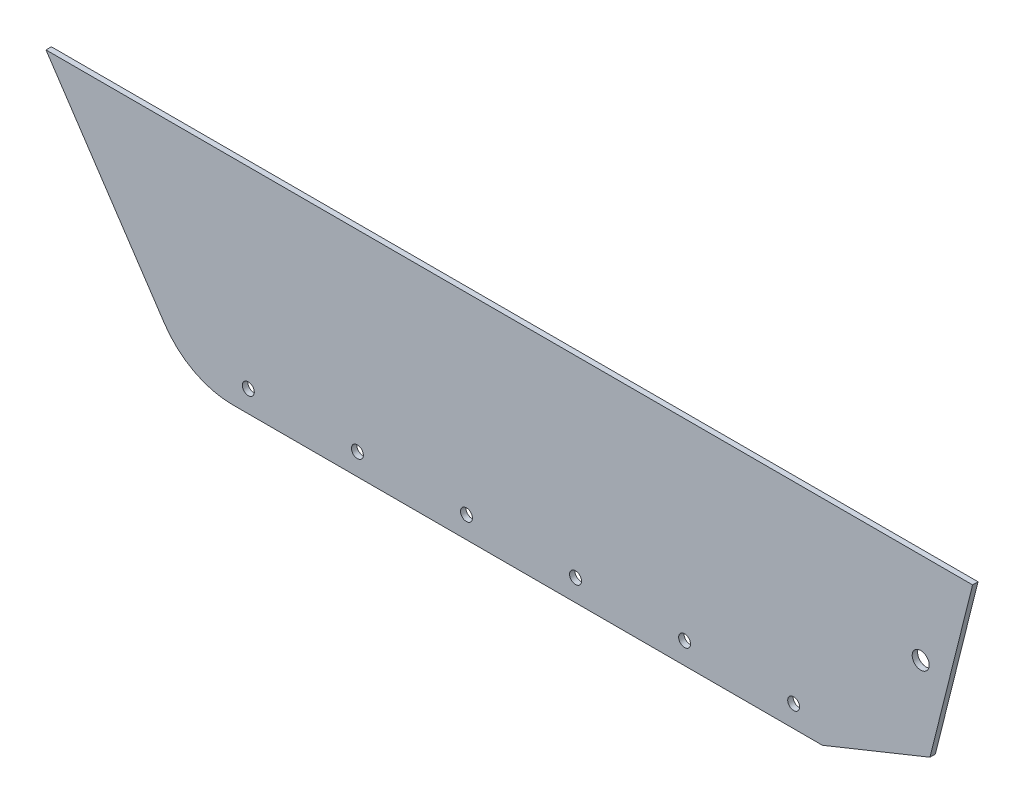
ISO-10303-21;
HEADER;
FILE_DESCRIPTION(('STEP AP214'),'2;1');
FILE_NAME('part.step','',(''),(''),'','','');
FILE_SCHEMA(('AUTOMOTIVE_DESIGN { 1 0 10303 214 1 1 1 1 }'));
ENDSEC;
DATA;
#1=APPLICATION_CONTEXT('core data for automotive mechanical design processes');
#2=APPLICATION_PROTOCOL_DEFINITION('international standard','automotive_design',2000,#1);
#3=PRODUCT_CONTEXT('',#1,'mechanical');
#4=PRODUCT('Part','Part','',(#3));
#5=PRODUCT_RELATED_PRODUCT_CATEGORY('part','',(#4));
#6=PRODUCT_DEFINITION_FORMATION('','',#4);
#7=PRODUCT_DEFINITION_CONTEXT('part definition',#1,'design');
#8=PRODUCT_DEFINITION('design','',#6,#7);
#9=PRODUCT_DEFINITION_SHAPE('','',#8);
#10=(LENGTH_UNIT() NAMED_UNIT(*) SI_UNIT(.MILLI.,.METRE.));
#11=(NAMED_UNIT(*) PLANE_ANGLE_UNIT() SI_UNIT($,.RADIAN.));
#12=(NAMED_UNIT(*) SI_UNIT($,.STERADIAN.) SOLID_ANGLE_UNIT());
#13=UNCERTAINTY_MEASURE_WITH_UNIT(LENGTH_MEASURE(1.E-05),#10,'distance_accuracy_value','');
#14=(GEOMETRIC_REPRESENTATION_CONTEXT(3) GLOBAL_UNCERTAINTY_ASSIGNED_CONTEXT((#13)) GLOBAL_UNIT_ASSIGNED_CONTEXT((#10,
#11,#12)) REPRESENTATION_CONTEXT('',''));
#15=CARTESIAN_POINT('',(0.,0.,0.));
#16=DIRECTION('',(0.,0.,1.));
#17=DIRECTION('',(1.,0.,0.));
#18=AXIS2_PLACEMENT_3D('',#15,#16,#17);
#19=CARTESIAN_POINT('',(-31.8794117647059,-96.6490196078432,3.175));
#20=DIRECTION('',(0.,1.,0.));
#21=DIRECTION('',(-1.,0.,0.));
#22=AXIS2_PLACEMENT_3D('',#19,#20,#21);
#23=PLANE('',#22);
#24=DIRECTION('',(1.,0.,0.));
#25=VECTOR('',#24,1.);
#26=CARTESIAN_POINT('',(-31.8794117647059,-96.6490196078432,0.));
#27=LINE('',#26,#25);
#28=CARTESIAN_POINT('',(-6.19059135728444,-96.6490196078432,0.));
#29=VERTEX_POINT('',#28);
#30=CARTESIAN_POINT('',(340.005873473177,-96.6490196078432,0.));
#31=VERTEX_POINT('',#30);
#32=EDGE_CURVE('E134',#29,#31,#27,.T.);
#33=ORIENTED_EDGE('',*,*,#32,.T.);
#34=DIRECTION('',(0.,0.,1.));
#35=VECTOR('',#34,1.);
#36=CARTESIAN_POINT('',(340.005873473177,-96.6490196078432,-6.825));
#37=LINE('',#36,#35);
#38=CARTESIAN_POINT('',(340.005873473177,-96.6490196078432,3.175));
#39=VERTEX_POINT('',#38);
#40=EDGE_CURVE('E61',#31,#39,#37,.T.);
#41=ORIENTED_EDGE('',*,*,#40,.T.);
#42=DIRECTION('',(1.,0.,0.));
#43=VECTOR('',#42,1.);
#44=CARTESIAN_POINT('',(-31.8794117647059,-96.6490196078432,3.175));
#45=LINE('',#44,#43);
#46=CARTESIAN_POINT('',(-6.19059135728444,-96.6490196078432,3.175));
#47=VERTEX_POINT('',#46);
#48=EDGE_CURVE('E118',#47,#39,#45,.T.);
#49=ORIENTED_EDGE('',*,*,#48,.F.);
#50=DIRECTION('',(0.,0.,-1.));
#51=VECTOR('',#50,1.);
#52=CARTESIAN_POINT('',(-6.19059135728444,-96.6490196078432,0.));
#53=LINE('',#52,#51);
#54=EDGE_CURVE('E107',#47,#29,#53,.T.);
#55=ORIENTED_EDGE('',*,*,#54,.T.);
#56=EDGE_LOOP('',(#33,#41,#49,#55));
#57=FACE_BOUND('',#56,.T.);
#58=ADVANCED_FACE('F46',(#57),#23,.F.);
#59=CARTESIAN_POINT('',(428.120588235294,28.9396179466764,3.175));
#60=DIRECTION('',(0.970193019893108,-0.242333456523632,0.));
#61=DIRECTION('',(0.242333456523632,0.970193019893108,0.));
#62=AXIS2_PLACEMENT_3D('',#59,#60,#61);
#63=PLANE('',#62);
#64=DIRECTION('',(-0.242333456523632,-0.970193019893108,0.));
#65=VECTOR('',#64,1.);
#66=CARTESIAN_POINT('',(428.120588235294,28.9396179466764,0.));
#67=LINE('',#66,#65);
#68=CARTESIAN_POINT('',(428.120588235294,28.9396179466764,0.));
#69=VERTEX_POINT('',#68);
#70=CARTESIAN_POINT('',(403.120588235294,-71.1490196078431,0.));
#71=VERTEX_POINT('',#70);
#72=EDGE_CURVE('E138',#69,#71,#67,.T.);
#73=ORIENTED_EDGE('',*,*,#72,.F.);
#74=DIRECTION('',(0.,0.,-1.));
#75=VECTOR('',#74,1.);
#76=CARTESIAN_POINT('',(428.120588235294,28.9396179466764,3.175));
#77=LINE('',#76,#75);
#78=CARTESIAN_POINT('',(428.120588235294,28.9396179466764,3.175));
#79=VERTEX_POINT('',#78);
#80=EDGE_CURVE('E108',#79,#69,#77,.T.);
#81=ORIENTED_EDGE('',*,*,#80,.F.);
#82=DIRECTION('',(-0.242333456523632,-0.970193019893108,0.));
#83=VECTOR('',#82,1.);
#84=CARTESIAN_POINT('',(428.120588235294,28.9396179466764,3.175));
#85=LINE('',#84,#83);
#86=CARTESIAN_POINT('',(403.120588235294,-71.1490196078431,3.175));
#87=VERTEX_POINT('',#86);
#88=EDGE_CURVE('E115',#79,#87,#85,.T.);
#89=ORIENTED_EDGE('',*,*,#88,.T.);
#90=DIRECTION('',(0.,0.,-1.));
#91=VECTOR('',#90,1.);
#92=CARTESIAN_POINT('',(403.120588235294,-71.1490196078431,3.175));
#93=LINE('',#92,#91);
#94=EDGE_CURVE('E98',#87,#71,#93,.T.);
#95=ORIENTED_EDGE('',*,*,#94,.T.);
#96=EDGE_LOOP('',(#73,#81,#89,#95));
#97=FACE_BOUND('',#96,.T.);
#98=ADVANCED_FACE('F122',(#97),#63,.T.);
#99=CARTESIAN_POINT('',(-115.605170134385,28.9396179466772,3.175));
#100=DIRECTION('',(0.,1.,0.));
#101=DIRECTION('',(-1.,0.,0.));
#102=AXIS2_PLACEMENT_3D('',#99,#100,#101);
#103=PLANE('',#102);
#104=DIRECTION('',(1.,0.,0.));
#105=VECTOR('',#104,1.);
#106=CARTESIAN_POINT('',(-115.605170134385,28.9396179466772,0.));
#107=LINE('',#106,#105);
#108=CARTESIAN_POINT('',(-115.605170134385,28.9396179466772,0.));
#109=VERTEX_POINT('',#108);
#110=EDGE_CURVE('E142',#109,#69,#107,.T.);
#111=ORIENTED_EDGE('',*,*,#110,.F.);
#112=DIRECTION('',(0.,0.,-1.));
#113=VECTOR('',#112,1.);
#114=CARTESIAN_POINT('',(-115.605170134385,28.9396179466772,3.175));
#115=LINE('',#114,#113);
#116=CARTESIAN_POINT('',(-115.605170134385,28.9396179466772,3.175));
#117=VERTEX_POINT('',#116);
#118=EDGE_CURVE('E128',#117,#109,#115,.T.);
#119=ORIENTED_EDGE('',*,*,#118,.F.);
#120=DIRECTION('',(1.,0.,0.));
#121=VECTOR('',#120,1.);
#122=CARTESIAN_POINT('',(-115.605170134385,28.9396179466772,3.175));
#123=LINE('',#122,#121);
#124=EDGE_CURVE('E124',#117,#79,#123,.T.);
#125=ORIENTED_EDGE('',*,*,#124,.T.);
#126=ORIENTED_EDGE('',*,*,#80,.T.);
#127=EDGE_LOOP('',(#111,#119,#125,#126));
#128=FACE_BOUND('',#127,.T.);
#129=ADVANCED_FACE('F174',(#128),#103,.T.);
#130=CARTESIAN_POINT('',(-98.8794117647059,3.85098039215685,3.175));
#131=DIRECTION('',(-0.832050294337855,-0.554700196225211,0.));
#132=DIRECTION('',(0.554700196225211,-0.832050294337856,0.));
#133=AXIS2_PLACEMENT_3D('',#130,#131,#132);
#134=PLANE('',#133);
#135=DIRECTION('',(-0.554700196225211,0.832050294337855,0.));
#136=VECTOR('',#135,1.);
#137=CARTESIAN_POINT('',(-98.8794117647059,3.85098039215685,0.));
#138=LINE('',#137,#136);
#139=CARTESIAN_POINT('',(-46.1290054855015,-75.2746290266534,0.));
#140=VERTEX_POINT('',#139);
#141=EDGE_CURVE('E146',#140,#109,#138,.T.);
#142=ORIENTED_EDGE('',*,*,#141,.F.);
#143=DIRECTION('',(0.,0.,-1.));
#144=VECTOR('',#143,1.);
#145=CARTESIAN_POINT('',(-46.1290054855015,-75.2746290266534,3.175));
#146=LINE('',#145,#144);
#147=CARTESIAN_POINT('',(-46.1290054854998,-75.2746290266522,3.175));
#148=VERTEX_POINT('',#147);
#149=EDGE_CURVE('E69',#140,#148,#146,.F.);
#150=ORIENTED_EDGE('',*,*,#149,.T.);
#151=DIRECTION('',(0.554700196225229,-0.832050294337844,0.));
#152=VECTOR('',#151,1.);
#153=CARTESIAN_POINT('',(-98.8794117647059,3.85098039215685,3.175));
#154=LINE('',#153,#152);
#155=EDGE_CURVE('E130',#117,#148,#154,.T.);
#156=ORIENTED_EDGE('',*,*,#155,.F.);
#157=ORIENTED_EDGE('',*,*,#118,.T.);
#158=EDGE_LOOP('',(#142,#150,#156,#157));
#159=FACE_BOUND('',#158,.T.);
#160=ADVANCED_FACE('F170',(#159),#134,.T.);
#161=CARTESIAN_POINT('',(0.,0.,3.175));
#162=DIRECTION('',(0.,0.,-1.));
#163=DIRECTION('',(-1.,0.,0.));
#164=AXIS2_PLACEMENT_3D('',#161,#162,#163);
#165=PLANE('',#164);
#166=CARTESIAN_POINT('',(397.67855813708,-24.6104052190861,3.175));
#167=DIRECTION('',(0.,0.,-1.));
#168=DIRECTION('',(-1.,0.,0.));
#169=AXIS2_PLACEMENT_3D('',#166,#167,#168);
#170=CIRCLE('',#169,4.99999999999999);
#171=CARTESIAN_POINT('',(392.67855813708,-24.6104052190861,3.175));
#172=VERTEX_POINT('',#171);
#173=EDGE_CURVE('E120',#172,#172,#170,.F.);
#174=ORIENTED_EDGE('',*,*,#173,.F.);
#175=EDGE_LOOP('',(#174));
#176=FACE_BOUND('',#175,.T.);
#177=CARTESIAN_POINT('',(3.1205882352941,-83.8990196078432,3.175));
#178=DIRECTION('',(0.,0.,1.));
#179=DIRECTION('',(1.,0.,0.));
#180=AXIS2_PLACEMENT_3D('',#177,#178,#179);
#181=CIRCLE('',#180,3.5);
#182=CARTESIAN_POINT('',(6.6205882352941,-83.8990196078432,3.175));
#183=VERTEX_POINT('',#182);
#184=EDGE_CURVE('E139',#183,#183,#181,.T.);
#185=ORIENTED_EDGE('',*,*,#184,.F.);
#186=EDGE_LOOP('',(#185));
#187=FACE_BOUND('',#186,.T.);
#188=CARTESIAN_POINT('',(67.1205882352941,-83.8990196078433,3.175));
#189=DIRECTION('',(0.,0.,1.));
#190=DIRECTION('',(1.,0.,0.));
#191=AXIS2_PLACEMENT_3D('',#188,#189,#190);
#192=CIRCLE('',#191,3.50000000000001);
#193=CARTESIAN_POINT('',(70.6205882352941,-83.8990196078433,3.175));
#194=VERTEX_POINT('',#193);
#195=EDGE_CURVE('E342',#194,#194,#192,.T.);
#196=ORIENTED_EDGE('',*,*,#195,.F.);
#197=EDGE_LOOP('',(#196));
#198=FACE_BOUND('',#197,.T.);
#199=CARTESIAN_POINT('',(131.120588235294,-83.8990196078432,3.175));
#200=DIRECTION('',(0.,0.,1.));
#201=DIRECTION('',(1.,0.,0.));
#202=AXIS2_PLACEMENT_3D('',#199,#200,#201);
#203=CIRCLE('',#202,3.49999999999999);
#204=CARTESIAN_POINT('',(134.620588235294,-83.8990196078432,3.175));
#205=VERTEX_POINT('',#204);
#206=EDGE_CURVE('E350',#205,#205,#203,.T.);
#207=ORIENTED_EDGE('',*,*,#206,.F.);
#208=EDGE_LOOP('',(#207));
#209=FACE_BOUND('',#208,.T.);
#210=CARTESIAN_POINT('',(195.120588235294,-83.8990196078432,3.175));
#211=DIRECTION('',(0.,0.,1.));
#212=DIRECTION('',(1.,0.,0.));
#213=AXIS2_PLACEMENT_3D('',#210,#211,#212);
#214=CIRCLE('',#213,3.49999999999999);
#215=CARTESIAN_POINT('',(198.620588235294,-83.8990196078432,3.175));
#216=VERTEX_POINT('',#215);
#217=EDGE_CURVE('E358',#216,#216,#214,.T.);
#218=ORIENTED_EDGE('',*,*,#217,.F.);
#219=EDGE_LOOP('',(#218));
#220=FACE_BOUND('',#219,.T.);
#221=CARTESIAN_POINT('',(259.120588235294,-83.8990196078432,3.175));
#222=DIRECTION('',(0.,0.,1.));
#223=DIRECTION('',(1.,0.,0.));
#224=AXIS2_PLACEMENT_3D('',#221,#222,#223);
#225=CIRCLE('',#224,3.50000000000002);
#226=CARTESIAN_POINT('',(262.620588235294,-83.8990196078432,3.175));
#227=VERTEX_POINT('',#226);
#228=EDGE_CURVE('E321',#227,#227,#225,.T.);
#229=ORIENTED_EDGE('',*,*,#228,.F.);
#230=EDGE_LOOP('',(#229));
#231=FACE_BOUND('',#230,.T.);
#232=CARTESIAN_POINT('',(323.120588235294,-83.8990196078432,3.175));
#233=DIRECTION('',(0.,0.,1.));
#234=DIRECTION('',(1.,0.,0.));
#235=AXIS2_PLACEMENT_3D('',#232,#233,#234);
#236=CIRCLE('',#235,3.50000000000002);
#237=CARTESIAN_POINT('',(326.620588235294,-83.8990196078432,3.175));
#238=VERTEX_POINT('',#237);
#239=EDGE_CURVE('E315',#238,#238,#236,.T.);
#240=ORIENTED_EDGE('',*,*,#239,.F.);
#241=EDGE_LOOP('',(#240));
#242=FACE_BOUND('',#241,.T.);
#243=ORIENTED_EDGE('',*,*,#48,.T.);
#244=DIRECTION('',(-0.92718385456679,-0.374606593415906,0.));
#245=VECTOR('',#244,1.);
#246=CARTESIAN_POINT('',(403.120588235294,-71.1490196078431,3.175));
#247=LINE('',#246,#245);
#248=EDGE_CURVE('E101',#87,#39,#247,.T.);
#249=ORIENTED_EDGE('',*,*,#248,.F.);
#250=ORIENTED_EDGE('',*,*,#88,.F.);
#251=ORIENTED_EDGE('',*,*,#124,.F.);
#252=ORIENTED_EDGE('',*,*,#155,.T.);
#253=CARTESIAN_POINT('',(-6.19059135728445,-48.6490196078432,3.175));
#254=DIRECTION('',(0.,0.,-1.));
#255=DIRECTION('',(-1.,0.,0.));
#256=AXIS2_PLACEMENT_3D('',#253,#254,#255);
#257=CIRCLE('',#256,48.);
#258=EDGE_CURVE('E55',#148,#47,#257,.F.);
#259=ORIENTED_EDGE('',*,*,#258,.T.);
#260=EDGE_LOOP('',(#243,#249,#250,#251,#252,#259));
#261=FACE_BOUND('',#260,.T.);
#262=ADVANCED_FACE('F113',(#176,#187,#198,#209,#220,#231,#242,#261),#165,.F.);
#263=CARTESIAN_POINT('',(0.,0.,0.));
#264=DIRECTION('',(0.,0.,-1.));
#265=DIRECTION('',(-1.,0.,0.));
#266=AXIS2_PLACEMENT_3D('',#263,#264,#265);
#267=PLANE('',#266);
#268=CARTESIAN_POINT('',(397.67855813708,-24.6104052190861,0.));
#269=DIRECTION('',(0.,0.,-1.));
#270=DIRECTION('',(-1.,0.,0.));
#271=AXIS2_PLACEMENT_3D('',#268,#269,#270);
#272=CIRCLE('',#271,4.99999999999999);
#273=CARTESIAN_POINT('',(392.67855813708,-24.6104052190861,0.));
#274=VERTEX_POINT('',#273);
#275=EDGE_CURVE('E372',#274,#274,#272,.T.);
#276=ORIENTED_EDGE('',*,*,#275,.F.);
#277=EDGE_LOOP('',(#276));
#278=FACE_BOUND('',#277,.T.);
#279=DIRECTION('',(0.92718385456679,0.374606593415906,0.));
#280=VECTOR('',#279,1.);
#281=CARTESIAN_POINT('',(81.2820834011268,-201.180216044419,0.));
#282=LINE('',#281,#280);
#283=EDGE_CURVE('E11',#31,#71,#282,.T.);
#284=ORIENTED_EDGE('',*,*,#283,.F.);
#285=ORIENTED_EDGE('',*,*,#32,.F.);
#286=CARTESIAN_POINT('',(-6.19059135728445,-48.6490196078432,0.));
#287=DIRECTION('',(0.,0.,-1.));
#288=DIRECTION('',(-1.,0.,0.));
#289=AXIS2_PLACEMENT_3D('',#286,#287,#288);
#290=CIRCLE('',#289,48.);
#291=EDGE_CURVE('E157',#29,#140,#290,.T.);
#292=ORIENTED_EDGE('',*,*,#291,.T.);
#293=ORIENTED_EDGE('',*,*,#141,.T.);
#294=ORIENTED_EDGE('',*,*,#110,.T.);
#295=ORIENTED_EDGE('',*,*,#72,.T.);
#296=EDGE_LOOP('',(#284,#285,#292,#293,#294,#295));
#297=FACE_BOUND('',#296,.T.);
#298=CARTESIAN_POINT('',(3.1205882352941,-83.8990196078432,0.));
#299=DIRECTION('',(0.,0.,1.));
#300=DIRECTION('',(1.,0.,0.));
#301=AXIS2_PLACEMENT_3D('',#298,#299,#300);
#302=CIRCLE('',#301,3.5);
#303=CARTESIAN_POINT('',(6.6205882352941,-83.8990196078432,0.));
#304=VERTEX_POINT('',#303);
#305=EDGE_CURVE('E334',#304,#304,#302,.T.);
#306=ORIENTED_EDGE('',*,*,#305,.T.);
#307=EDGE_LOOP('',(#306));
#308=FACE_BOUND('',#307,.T.);
#309=CARTESIAN_POINT('',(67.1205882352941,-83.8990196078433,0.));
#310=DIRECTION('',(0.,0.,1.));
#311=DIRECTION('',(1.,0.,0.));
#312=AXIS2_PLACEMENT_3D('',#309,#310,#311);
#313=CIRCLE('',#312,3.50000000000001);
#314=CARTESIAN_POINT('',(70.6205882352941,-83.8990196078433,0.));
#315=VERTEX_POINT('',#314);
#316=EDGE_CURVE('E338',#315,#315,#313,.T.);
#317=ORIENTED_EDGE('',*,*,#316,.T.);
#318=EDGE_LOOP('',(#317));
#319=FACE_BOUND('',#318,.T.);
#320=CARTESIAN_POINT('',(131.120588235294,-83.8990196078432,0.));
#321=DIRECTION('',(0.,0.,1.));
#322=DIRECTION('',(1.,0.,0.));
#323=AXIS2_PLACEMENT_3D('',#320,#321,#322);
#324=CIRCLE('',#323,3.49999999999999);
#325=CARTESIAN_POINT('',(134.620588235294,-83.8990196078432,0.));
#326=VERTEX_POINT('',#325);
#327=EDGE_CURVE('E346',#326,#326,#324,.T.);
#328=ORIENTED_EDGE('',*,*,#327,.T.);
#329=EDGE_LOOP('',(#328));
#330=FACE_BOUND('',#329,.T.);
#331=CARTESIAN_POINT('',(195.120588235294,-83.8990196078432,0.));
#332=DIRECTION('',(0.,0.,1.));
#333=DIRECTION('',(1.,0.,0.));
#334=AXIS2_PLACEMENT_3D('',#331,#332,#333);
#335=CIRCLE('',#334,3.49999999999999);
#336=CARTESIAN_POINT('',(198.620588235294,-83.8990196078432,0.));
#337=VERTEX_POINT('',#336);
#338=EDGE_CURVE('E354',#337,#337,#335,.T.);
#339=ORIENTED_EDGE('',*,*,#338,.T.);
#340=EDGE_LOOP('',(#339));
#341=FACE_BOUND('',#340,.T.);
#342=CARTESIAN_POINT('',(259.120588235294,-83.8990196078432,0.));
#343=DIRECTION('',(0.,0.,1.));
#344=DIRECTION('',(1.,0.,0.));
#345=AXIS2_PLACEMENT_3D('',#342,#343,#344);
#346=CIRCLE('',#345,3.50000000000002);
#347=CARTESIAN_POINT('',(262.620588235294,-83.8990196078432,0.));
#348=VERTEX_POINT('',#347);
#349=EDGE_CURVE('E326',#348,#348,#346,.T.);
#350=ORIENTED_EDGE('',*,*,#349,.T.);
#351=EDGE_LOOP('',(#350));
#352=FACE_BOUND('',#351,.T.);
#353=CARTESIAN_POINT('',(323.120588235294,-83.8990196078432,0.));
#354=DIRECTION('',(0.,0.,1.));
#355=DIRECTION('',(1.,0.,0.));
#356=AXIS2_PLACEMENT_3D('',#353,#354,#355);
#357=CIRCLE('',#356,3.50000000000002);
#358=CARTESIAN_POINT('',(326.620588235294,-83.8990196078432,0.));
#359=VERTEX_POINT('',#358);
#360=EDGE_CURVE('E318',#359,#359,#357,.T.);
#361=ORIENTED_EDGE('',*,*,#360,.T.);
#362=EDGE_LOOP('',(#361));
#363=FACE_BOUND('',#362,.T.);
#364=ADVANCED_FACE('F168',(#278,#297,#308,#319,#330,#341,#352,#363),#267,.T.);
#365=CARTESIAN_POINT('',(323.120588235294,-83.8990196078432,3.175));
#366=DIRECTION('',(0.,0.,-1.));
#367=DIRECTION('',(-1.,0.,0.));
#368=AXIS2_PLACEMENT_3D('',#365,#366,#367);
#369=CYLINDRICAL_SURFACE('',#368,3.50000000000002);
#370=ORIENTED_EDGE('',*,*,#239,.T.);
#371=EDGE_LOOP('',(#370));
#372=FACE_BOUND('',#371,.T.);
#373=ORIENTED_EDGE('',*,*,#360,.F.);
#374=EDGE_LOOP('',(#373));
#375=FACE_BOUND('',#374,.T.);
#376=ADVANCED_FACE('F220',(#372,#375),#369,.F.);
#377=CARTESIAN_POINT('',(259.120588235294,-83.8990196078432,3.175));
#378=DIRECTION('',(0.,0.,-1.));
#379=DIRECTION('',(-1.,0.,0.));
#380=AXIS2_PLACEMENT_3D('',#377,#378,#379);
#381=CYLINDRICAL_SURFACE('',#380,3.50000000000002);
#382=ORIENTED_EDGE('',*,*,#228,.T.);
#383=EDGE_LOOP('',(#382));
#384=FACE_BOUND('',#383,.T.);
#385=ORIENTED_EDGE('',*,*,#349,.F.);
#386=EDGE_LOOP('',(#385));
#387=FACE_BOUND('',#386,.T.);
#388=ADVANCED_FACE('F272',(#384,#387),#381,.F.);
#389=CARTESIAN_POINT('',(195.120588235294,-83.8990196078432,3.175));
#390=DIRECTION('',(0.,0.,-1.));
#391=DIRECTION('',(-1.,0.,0.));
#392=AXIS2_PLACEMENT_3D('',#389,#390,#391);
#393=CYLINDRICAL_SURFACE('',#392,3.49999999999999);
#394=ORIENTED_EDGE('',*,*,#217,.T.);
#395=EDGE_LOOP('',(#394));
#396=FACE_BOUND('',#395,.T.);
#397=ORIENTED_EDGE('',*,*,#338,.F.);
#398=EDGE_LOOP('',(#397));
#399=FACE_BOUND('',#398,.T.);
#400=ADVANCED_FACE('F263',(#396,#399),#393,.F.);
#401=CARTESIAN_POINT('',(131.120588235294,-83.8990196078432,3.175));
#402=DIRECTION('',(0.,0.,-1.));
#403=DIRECTION('',(-1.,0.,0.));
#404=AXIS2_PLACEMENT_3D('',#401,#402,#403);
#405=CYLINDRICAL_SURFACE('',#404,3.49999999999999);
#406=ORIENTED_EDGE('',*,*,#206,.T.);
#407=EDGE_LOOP('',(#406));
#408=FACE_BOUND('',#407,.T.);
#409=ORIENTED_EDGE('',*,*,#327,.F.);
#410=EDGE_LOOP('',(#409));
#411=FACE_BOUND('',#410,.T.);
#412=ADVANCED_FACE('F254',(#408,#411),#405,.F.);
#413=CARTESIAN_POINT('',(67.1205882352941,-83.8990196078433,3.175));
#414=DIRECTION('',(0.,0.,-1.));
#415=DIRECTION('',(-1.,0.,0.));
#416=AXIS2_PLACEMENT_3D('',#413,#414,#415);
#417=CYLINDRICAL_SURFACE('',#416,3.50000000000001);
#418=ORIENTED_EDGE('',*,*,#195,.T.);
#419=EDGE_LOOP('',(#418));
#420=FACE_BOUND('',#419,.T.);
#421=ORIENTED_EDGE('',*,*,#316,.F.);
#422=EDGE_LOOP('',(#421));
#423=FACE_BOUND('',#422,.T.);
#424=ADVANCED_FACE('F245',(#420,#423),#417,.F.);
#425=CARTESIAN_POINT('',(3.1205882352941,-83.8990196078432,3.175));
#426=DIRECTION('',(0.,0.,-1.));
#427=DIRECTION('',(-1.,0.,0.));
#428=AXIS2_PLACEMENT_3D('',#425,#426,#427);
#429=CYLINDRICAL_SURFACE('',#428,3.5);
#430=ORIENTED_EDGE('',*,*,#184,.T.);
#431=EDGE_LOOP('',(#430));
#432=FACE_BOUND('',#431,.T.);
#433=ORIENTED_EDGE('',*,*,#305,.F.);
#434=EDGE_LOOP('',(#433));
#435=FACE_BOUND('',#434,.T.);
#436=ADVANCED_FACE('F238',(#432,#435),#429,.F.);
#437=CARTESIAN_POINT('',(-6.19059135728445,-48.6490196078432,3.175));
#438=DIRECTION('',(0.,0.,1.));
#439=DIRECTION('',(1.,0.,0.));
#440=AXIS2_PLACEMENT_3D('',#437,#438,#439);
#441=CYLINDRICAL_SURFACE('',#440,48.);
#442=ORIENTED_EDGE('',*,*,#258,.F.);
#443=ORIENTED_EDGE('',*,*,#149,.F.);
#444=ORIENTED_EDGE('',*,*,#291,.F.);
#445=ORIENTED_EDGE('',*,*,#54,.F.);
#446=EDGE_LOOP('',(#442,#443,#444,#445));
#447=FACE_BOUND('',#446,.T.);
#448=ADVANCED_FACE('F48',(#447),#441,.T.);
#449=CARTESIAN_POINT('',(403.120588235294,-71.1490196078431,-6.825));
#450=DIRECTION('',(-0.374606593415906,0.92718385456679,0.));
#451=DIRECTION('',(-0.92718385456679,-0.374606593415906,0.));
#452=AXIS2_PLACEMENT_3D('',#449,#450,#451);
#453=PLANE('',#452);
#454=ORIENTED_EDGE('',*,*,#283,.T.);
#455=ORIENTED_EDGE('',*,*,#94,.F.);
#456=ORIENTED_EDGE('',*,*,#248,.T.);
#457=ORIENTED_EDGE('',*,*,#40,.F.);
#458=EDGE_LOOP('',(#454,#455,#456,#457));
#459=FACE_BOUND('',#458,.T.);
#460=ADVANCED_FACE('F100',(#459),#453,.F.);
#461=CARTESIAN_POINT('',(397.67855813708,-24.6104052190861,3.176));
#462=DIRECTION('',(0.,0.,-1.));
#463=DIRECTION('',(-1.,0.,0.));
#464=AXIS2_PLACEMENT_3D('',#461,#462,#463);
#465=CYLINDRICAL_SURFACE('',#464,4.99999999999999);
#466=ORIENTED_EDGE('',*,*,#275,.T.);
#467=EDGE_LOOP('',(#466));
#468=FACE_BOUND('',#467,.T.);
#469=ORIENTED_EDGE('',*,*,#173,.T.);
#470=EDGE_LOOP('',(#469));
#471=FACE_BOUND('',#470,.T.);
#472=ADVANCED_FACE('F202',(#468,#471),#465,.F.);
#473=CLOSED_SHELL('',(#58,#98,#129,#160,#262,#364,#376,#388,#400,#412,#424,#436,#448,#460,#472));
#474=MANIFOLD_SOLID_BREP('B2',#473);
#475=ADVANCED_BREP_SHAPE_REPRESENTATION('',(#18,#474),#14);
#476=SHAPE_DEFINITION_REPRESENTATION(#9,#475);
ENDSEC;
END-ISO-10303-21;
